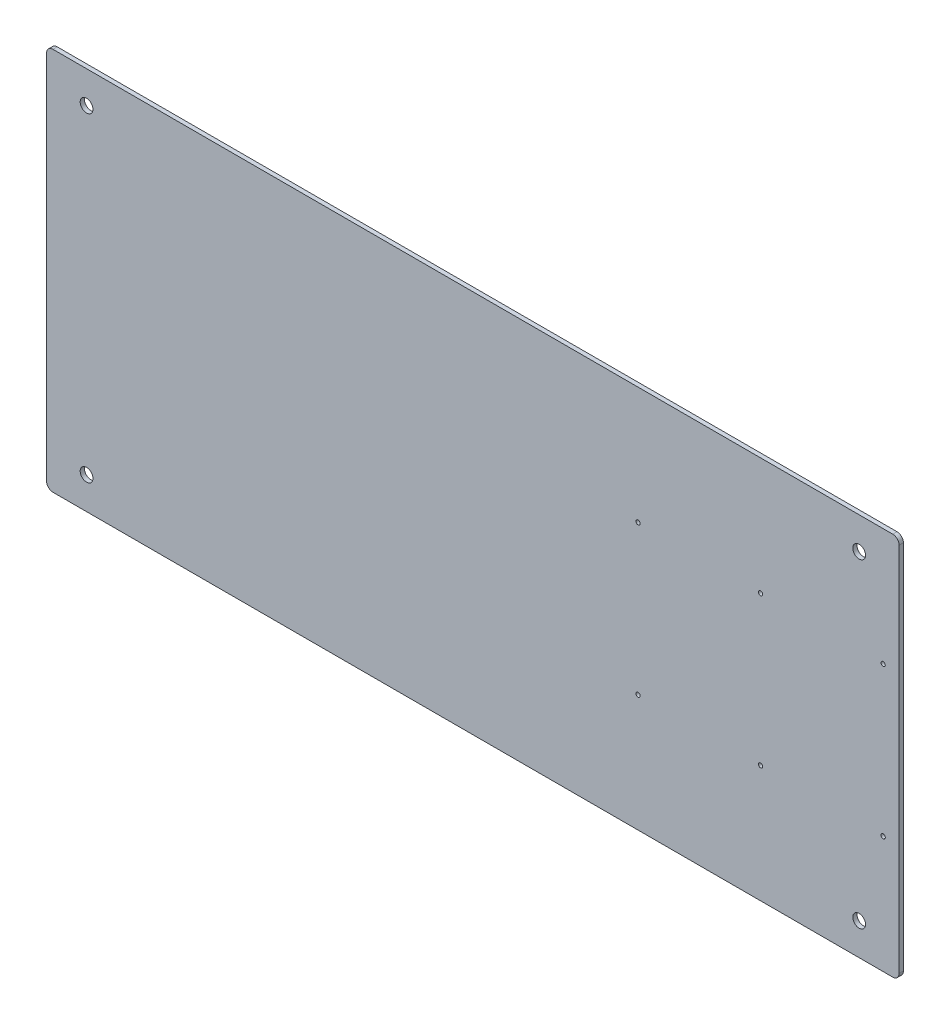
ISO-10303-21;
HEADER;
FILE_DESCRIPTION(('STEP AP214'),'2;1');
FILE_NAME('part.step','',(''),(''),'','','');
FILE_SCHEMA(('AUTOMOTIVE_DESIGN { 1 0 10303 214 1 1 1 1 }'));
ENDSEC;
DATA;
#1=APPLICATION_CONTEXT('core data for automotive mechanical design processes');
#2=APPLICATION_PROTOCOL_DEFINITION('international standard','automotive_design',2000,#1);
#3=PRODUCT_CONTEXT('',#1,'mechanical');
#4=PRODUCT('Part','Part','',(#3));
#5=PRODUCT_RELATED_PRODUCT_CATEGORY('part','',(#4));
#6=PRODUCT_DEFINITION_FORMATION('','',#4);
#7=PRODUCT_DEFINITION_CONTEXT('part definition',#1,'design');
#8=PRODUCT_DEFINITION('design','',#6,#7);
#9=PRODUCT_DEFINITION_SHAPE('','',#8);
#10=(LENGTH_UNIT() NAMED_UNIT(*) SI_UNIT(.MILLI.,.METRE.));
#11=(NAMED_UNIT(*) PLANE_ANGLE_UNIT() SI_UNIT($,.RADIAN.));
#12=(NAMED_UNIT(*) SI_UNIT($,.STERADIAN.) SOLID_ANGLE_UNIT());
#13=UNCERTAINTY_MEASURE_WITH_UNIT(LENGTH_MEASURE(1.E-05),#10,'distance_accuracy_value','');
#14=(GEOMETRIC_REPRESENTATION_CONTEXT(3) GLOBAL_UNCERTAINTY_ASSIGNED_CONTEXT((#13)) GLOBAL_UNIT_ASSIGNED_CONTEXT((#10,
#11,#12)) REPRESENTATION_CONTEXT('',''));
#15=CARTESIAN_POINT('',(0.,0.,0.));
#16=DIRECTION('',(0.,0.,1.));
#17=DIRECTION('',(1.,0.,0.));
#18=AXIS2_PLACEMENT_3D('',#15,#16,#17);
#19=CARTESIAN_POINT('',(0.,0.,4.));
#20=DIRECTION('',(0.,0.,-1.));
#21=DIRECTION('',(-1.,0.,0.));
#22=AXIS2_PLACEMENT_3D('',#19,#20,#21);
#23=PLANE('',#22);
#24=DIRECTION('',(0.,-1.,0.));
#25=VECTOR('',#24,1.);
#26=CARTESIAN_POINT('',(-400.,-180.,4.));
#27=LINE('',#26,#25);
#28=CARTESIAN_POINT('',(-400.,174.,4.));
#29=VERTEX_POINT('',#28);
#30=CARTESIAN_POINT('',(-400.,-174.,4.));
#31=VERTEX_POINT('',#30);
#32=EDGE_CURVE('E185',#29,#31,#27,.T.);
#33=ORIENTED_EDGE('',*,*,#32,.T.);
#34=CARTESIAN_POINT('',(-394.,-174.,4.));
#35=DIRECTION('',(0.,0.,-1.));
#36=DIRECTION('',(-1.,0.,0.));
#37=AXIS2_PLACEMENT_3D('',#34,#35,#36);
#38=CIRCLE('',#37,6.);
#39=CARTESIAN_POINT('',(-394.,-180.,4.));
#40=VERTEX_POINT('',#39);
#41=EDGE_CURVE('E173',#31,#40,#38,.F.);
#42=ORIENTED_EDGE('',*,*,#41,.T.);
#43=DIRECTION('',(1.,0.,0.));
#44=VECTOR('',#43,1.);
#45=CARTESIAN_POINT('',(-400.,-180.,4.));
#46=LINE('',#45,#44);
#47=CARTESIAN_POINT('',(394.,-180.,4.));
#48=VERTEX_POINT('',#47);
#49=EDGE_CURVE('E131',#40,#48,#46,.T.);
#50=ORIENTED_EDGE('',*,*,#49,.T.);
#51=CARTESIAN_POINT('',(394.,-174.,4.));
#52=DIRECTION('',(0.,0.,-1.));
#53=DIRECTION('',(-1.,0.,0.));
#54=AXIS2_PLACEMENT_3D('',#51,#52,#53);
#55=CIRCLE('',#54,6.);
#56=CARTESIAN_POINT('',(400.,-174.,4.));
#57=VERTEX_POINT('',#56);
#58=EDGE_CURVE('E170',#48,#57,#55,.F.);
#59=ORIENTED_EDGE('',*,*,#58,.T.);
#60=DIRECTION('',(0.,1.,0.));
#61=VECTOR('',#60,1.);
#62=CARTESIAN_POINT('',(400.,-180.,4.));
#63=LINE('',#62,#61);
#64=CARTESIAN_POINT('',(400.,174.,4.));
#65=VERTEX_POINT('',#64);
#66=EDGE_CURVE('E140',#57,#65,#63,.T.);
#67=ORIENTED_EDGE('',*,*,#66,.T.);
#68=CARTESIAN_POINT('',(394.,174.,4.));
#69=DIRECTION('',(0.,0.,-1.));
#70=DIRECTION('',(-1.,0.,0.));
#71=AXIS2_PLACEMENT_3D('',#68,#69,#70);
#72=CIRCLE('',#71,6.);
#73=CARTESIAN_POINT('',(394.,180.,4.));
#74=VERTEX_POINT('',#73);
#75=EDGE_CURVE('E65',#65,#74,#72,.F.);
#76=ORIENTED_EDGE('',*,*,#75,.T.);
#77=DIRECTION('',(-1.,0.,0.));
#78=VECTOR('',#77,1.);
#79=CARTESIAN_POINT('',(-400.,180.,4.));
#80=LINE('',#79,#78);
#81=CARTESIAN_POINT('',(-394.,180.,4.));
#82=VERTEX_POINT('',#81);
#83=EDGE_CURVE('E145',#74,#82,#80,.T.);
#84=ORIENTED_EDGE('',*,*,#83,.T.);
#85=CARTESIAN_POINT('',(-394.,174.,4.));
#86=DIRECTION('',(0.,0.,-1.));
#87=DIRECTION('',(-1.,0.,0.));
#88=AXIS2_PLACEMENT_3D('',#85,#86,#87);
#89=CIRCLE('',#88,6.);
#90=EDGE_CURVE('E165',#82,#29,#89,.F.);
#91=ORIENTED_EDGE('',*,*,#90,.T.);
#92=EDGE_LOOP('',(#33,#42,#50,#59,#67,#76,#84,#91));
#93=FACE_BOUND('',#92,.T.);
#94=CARTESIAN_POINT('',(-362.5,-150.,4.));
#95=DIRECTION('',(0.,0.,1.));
#96=DIRECTION('',(1.,0.,0.));
#97=AXIS2_PLACEMENT_3D('',#94,#95,#96);
#98=CIRCLE('',#97,5.99999999999999);
#99=CARTESIAN_POINT('',(-356.5,-150.,4.));
#100=VERTEX_POINT('',#99);
#101=EDGE_CURVE('E197',#100,#100,#98,.T.);
#102=ORIENTED_EDGE('',*,*,#101,.F.);
#103=EDGE_LOOP('',(#102));
#104=FACE_BOUND('',#103,.T.);
#105=CARTESIAN_POINT('',(-362.5,150.,4.));
#106=DIRECTION('',(0.,0.,1.));
#107=DIRECTION('',(1.,0.,0.));
#108=AXIS2_PLACEMENT_3D('',#105,#106,#107);
#109=CIRCLE('',#108,5.99999999999999);
#110=CARTESIAN_POINT('',(-356.5,150.,4.));
#111=VERTEX_POINT('',#110);
#112=EDGE_CURVE('E339',#111,#111,#109,.T.);
#113=ORIENTED_EDGE('',*,*,#112,.F.);
#114=EDGE_LOOP('',(#113));
#115=FACE_BOUND('',#114,.T.);
#116=CARTESIAN_POINT('',(362.5,-150.,4.));
#117=DIRECTION('',(0.,0.,1.));
#118=DIRECTION('',(1.,0.,0.));
#119=AXIS2_PLACEMENT_3D('',#116,#117,#118);
#120=CIRCLE('',#119,5.99999999999999);
#121=CARTESIAN_POINT('',(368.5,-150.,4.));
#122=VERTEX_POINT('',#121);
#123=EDGE_CURVE('E331',#122,#122,#120,.T.);
#124=ORIENTED_EDGE('',*,*,#123,.F.);
#125=EDGE_LOOP('',(#124));
#126=FACE_BOUND('',#125,.T.);
#127=CARTESIAN_POINT('',(362.5,150.,4.));
#128=DIRECTION('',(0.,0.,1.));
#129=DIRECTION('',(1.,0.,0.));
#130=AXIS2_PLACEMENT_3D('',#127,#128,#129);
#131=CIRCLE('',#130,5.99999999999999);
#132=CARTESIAN_POINT('',(368.5,150.,4.));
#133=VERTEX_POINT('',#132);
#134=EDGE_CURVE('E323',#133,#133,#131,.T.);
#135=ORIENTED_EDGE('',*,*,#134,.F.);
#136=EDGE_LOOP('',(#135));
#137=FACE_BOUND('',#136,.T.);
#138=CARTESIAN_POINT('',(155.,70.,4.));
#139=DIRECTION('',(0.,0.,1.));
#140=DIRECTION('',(1.,0.,0.));
#141=AXIS2_PLACEMENT_3D('',#138,#139,#140);
#142=CIRCLE('',#141,2.);
#143=CARTESIAN_POINT('',(157.,70.,4.));
#144=VERTEX_POINT('',#143);
#145=EDGE_CURVE('E315',#144,#144,#142,.T.);
#146=ORIENTED_EDGE('',*,*,#145,.F.);
#147=EDGE_LOOP('',(#146));
#148=FACE_BOUND('',#147,.T.);
#149=CARTESIAN_POINT('',(270.,70.,4.));
#150=DIRECTION('',(0.,0.,1.));
#151=DIRECTION('',(1.,0.,0.));
#152=AXIS2_PLACEMENT_3D('',#149,#150,#151);
#153=CIRCLE('',#152,2.);
#154=CARTESIAN_POINT('',(272.,70.,4.));
#155=VERTEX_POINT('',#154);
#156=EDGE_CURVE('E307',#155,#155,#153,.T.);
#157=ORIENTED_EDGE('',*,*,#156,.F.);
#158=EDGE_LOOP('',(#157));
#159=FACE_BOUND('',#158,.T.);
#160=CARTESIAN_POINT('',(385.,70.,4.));
#161=DIRECTION('',(0.,0.,1.));
#162=DIRECTION('',(1.,0.,0.));
#163=AXIS2_PLACEMENT_3D('',#160,#161,#162);
#164=CIRCLE('',#163,2.);
#165=CARTESIAN_POINT('',(387.,70.,4.));
#166=VERTEX_POINT('',#165);
#167=EDGE_CURVE('E299',#166,#166,#164,.T.);
#168=ORIENTED_EDGE('',*,*,#167,.F.);
#169=EDGE_LOOP('',(#168));
#170=FACE_BOUND('',#169,.T.);
#171=CARTESIAN_POINT('',(385.,-70.,4.));
#172=DIRECTION('',(0.,0.,1.));
#173=DIRECTION('',(1.,0.,0.));
#174=AXIS2_PLACEMENT_3D('',#171,#172,#173);
#175=CIRCLE('',#174,2.);
#176=CARTESIAN_POINT('',(387.,-70.,4.));
#177=VERTEX_POINT('',#176);
#178=EDGE_CURVE('E291',#177,#177,#175,.T.);
#179=ORIENTED_EDGE('',*,*,#178,.F.);
#180=EDGE_LOOP('',(#179));
#181=FACE_BOUND('',#180,.T.);
#182=CARTESIAN_POINT('',(270.,-70.,4.));
#183=DIRECTION('',(0.,0.,1.));
#184=DIRECTION('',(1.,0.,0.));
#185=AXIS2_PLACEMENT_3D('',#182,#183,#184);
#186=CIRCLE('',#185,2.);
#187=CARTESIAN_POINT('',(272.,-70.,4.));
#188=VERTEX_POINT('',#187);
#189=EDGE_CURVE('E283',#188,#188,#186,.T.);
#190=ORIENTED_EDGE('',*,*,#189,.F.);
#191=EDGE_LOOP('',(#190));
#192=FACE_BOUND('',#191,.T.);
#193=CARTESIAN_POINT('',(155.,-70.,4.));
#194=DIRECTION('',(0.,0.,1.));
#195=DIRECTION('',(1.,0.,0.));
#196=AXIS2_PLACEMENT_3D('',#193,#194,#195);
#197=CIRCLE('',#196,2.);
#198=CARTESIAN_POINT('',(157.,-70.,4.));
#199=VERTEX_POINT('',#198);
#200=EDGE_CURVE('E272',#199,#199,#197,.T.);
#201=ORIENTED_EDGE('',*,*,#200,.F.);
#202=EDGE_LOOP('',(#201));
#203=FACE_BOUND('',#202,.T.);
#204=ADVANCED_FACE('F43',(#93,#104,#115,#126,#137,#148,#159,#170,#181,#192,#203),#23,.F.);
#205=CARTESIAN_POINT('',(0.,0.,0.));
#206=DIRECTION('',(0.,0.,-1.));
#207=DIRECTION('',(-1.,0.,0.));
#208=AXIS2_PLACEMENT_3D('',#205,#206,#207);
#209=PLANE('',#208);
#210=CARTESIAN_POINT('',(270.,-70.,0.));
#211=DIRECTION('',(0.,0.,1.));
#212=DIRECTION('',(1.,0.,0.));
#213=AXIS2_PLACEMENT_3D('',#210,#211,#212);
#214=CIRCLE('',#213,2.);
#215=CARTESIAN_POINT('',(272.,-70.,0.));
#216=VERTEX_POINT('',#215);
#217=EDGE_CURVE('E280',#216,#216,#214,.T.);
#218=ORIENTED_EDGE('',*,*,#217,.T.);
#219=EDGE_LOOP('',(#218));
#220=FACE_BOUND('',#219,.T.);
#221=CARTESIAN_POINT('',(385.,70.,0.));
#222=DIRECTION('',(0.,0.,1.));
#223=DIRECTION('',(1.,0.,0.));
#224=AXIS2_PLACEMENT_3D('',#221,#222,#223);
#225=CIRCLE('',#224,2.);
#226=CARTESIAN_POINT('',(387.,70.,0.));
#227=VERTEX_POINT('',#226);
#228=EDGE_CURVE('E295',#227,#227,#225,.T.);
#229=ORIENTED_EDGE('',*,*,#228,.T.);
#230=EDGE_LOOP('',(#229));
#231=FACE_BOUND('',#230,.T.);
#232=CARTESIAN_POINT('',(155.,70.,0.));
#233=DIRECTION('',(0.,0.,1.));
#234=DIRECTION('',(1.,0.,0.));
#235=AXIS2_PLACEMENT_3D('',#232,#233,#234);
#236=CIRCLE('',#235,2.);
#237=CARTESIAN_POINT('',(157.,70.,0.));
#238=VERTEX_POINT('',#237);
#239=EDGE_CURVE('E311',#238,#238,#236,.T.);
#240=ORIENTED_EDGE('',*,*,#239,.T.);
#241=EDGE_LOOP('',(#240));
#242=FACE_BOUND('',#241,.T.);
#243=CARTESIAN_POINT('',(362.5,-150.,0.));
#244=DIRECTION('',(0.,0.,1.));
#245=DIRECTION('',(1.,0.,0.));
#246=AXIS2_PLACEMENT_3D('',#243,#244,#245);
#247=CIRCLE('',#246,5.99999999999999);
#248=CARTESIAN_POINT('',(368.5,-150.,0.));
#249=VERTEX_POINT('',#248);
#250=EDGE_CURVE('E327',#249,#249,#247,.T.);
#251=ORIENTED_EDGE('',*,*,#250,.T.);
#252=EDGE_LOOP('',(#251));
#253=FACE_BOUND('',#252,.T.);
#254=CARTESIAN_POINT('',(-362.5,-150.,0.));
#255=DIRECTION('',(0.,0.,1.));
#256=DIRECTION('',(1.,0.,0.));
#257=AXIS2_PLACEMENT_3D('',#254,#255,#256);
#258=CIRCLE('',#257,5.99999999999999);
#259=CARTESIAN_POINT('',(-356.5,-150.,0.));
#260=VERTEX_POINT('',#259);
#261=EDGE_CURVE('E343',#260,#260,#258,.T.);
#262=ORIENTED_EDGE('',*,*,#261,.T.);
#263=EDGE_LOOP('',(#262));
#264=FACE_BOUND('',#263,.T.);
#265=DIRECTION('',(1.,0.,0.));
#266=VECTOR('',#265,1.);
#267=CARTESIAN_POINT('',(-400.,-180.,0.));
#268=LINE('',#267,#266);
#269=CARTESIAN_POINT('',(-394.,-180.,0.));
#270=VERTEX_POINT('',#269);
#271=CARTESIAN_POINT('',(394.,-180.,0.));
#272=VERTEX_POINT('',#271);
#273=EDGE_CURVE('E128',#270,#272,#268,.T.);
#274=ORIENTED_EDGE('',*,*,#273,.F.);
#275=CARTESIAN_POINT('',(-394.,-174.,0.));
#276=DIRECTION('',(0.,0.,-1.));
#277=DIRECTION('',(-1.,0.,0.));
#278=AXIS2_PLACEMENT_3D('',#275,#276,#277);
#279=CIRCLE('',#278,6.);
#280=CARTESIAN_POINT('',(-400.,-174.,0.));
#281=VERTEX_POINT('',#280);
#282=EDGE_CURVE('E110',#270,#281,#279,.T.);
#283=ORIENTED_EDGE('',*,*,#282,.T.);
#284=DIRECTION('',(0.,-1.,0.));
#285=VECTOR('',#284,1.);
#286=CARTESIAN_POINT('',(-400.,-180.,0.));
#287=LINE('',#286,#285);
#288=CARTESIAN_POINT('',(-400.,174.,0.));
#289=VERTEX_POINT('',#288);
#290=EDGE_CURVE('E141',#289,#281,#287,.T.);
#291=ORIENTED_EDGE('',*,*,#290,.F.);
#292=CARTESIAN_POINT('',(-394.,174.,0.));
#293=DIRECTION('',(0.,0.,-1.));
#294=DIRECTION('',(-1.,0.,0.));
#295=AXIS2_PLACEMENT_3D('',#292,#293,#294);
#296=CIRCLE('',#295,6.);
#297=CARTESIAN_POINT('',(-394.,180.,0.));
#298=VERTEX_POINT('',#297);
#299=EDGE_CURVE('E133',#289,#298,#296,.T.);
#300=ORIENTED_EDGE('',*,*,#299,.T.);
#301=DIRECTION('',(-1.,0.,0.));
#302=VECTOR('',#301,1.);
#303=CARTESIAN_POINT('',(-400.,180.,0.));
#304=LINE('',#303,#302);
#305=CARTESIAN_POINT('',(394.,180.,0.));
#306=VERTEX_POINT('',#305);
#307=EDGE_CURVE('E147',#306,#298,#304,.T.);
#308=ORIENTED_EDGE('',*,*,#307,.F.);
#309=CARTESIAN_POINT('',(394.,174.,0.));
#310=DIRECTION('',(0.,0.,-1.));
#311=DIRECTION('',(-1.,0.,0.));
#312=AXIS2_PLACEMENT_3D('',#309,#310,#311);
#313=CIRCLE('',#312,6.);
#314=CARTESIAN_POINT('',(400.,174.,0.));
#315=VERTEX_POINT('',#314);
#316=EDGE_CURVE('E155',#306,#315,#313,.T.);
#317=ORIENTED_EDGE('',*,*,#316,.T.);
#318=DIRECTION('',(0.,1.,0.));
#319=VECTOR('',#318,1.);
#320=CARTESIAN_POINT('',(400.,-180.,0.));
#321=LINE('',#320,#319);
#322=CARTESIAN_POINT('',(400.,-174.,0.));
#323=VERTEX_POINT('',#322);
#324=EDGE_CURVE('E194',#323,#315,#321,.T.);
#325=ORIENTED_EDGE('',*,*,#324,.F.);
#326=CARTESIAN_POINT('',(394.,-174.,0.));
#327=DIRECTION('',(0.,0.,-1.));
#328=DIRECTION('',(-1.,0.,0.));
#329=AXIS2_PLACEMENT_3D('',#326,#327,#328);
#330=CIRCLE('',#329,6.);
#331=EDGE_CURVE('E122',#323,#272,#330,.T.);
#332=ORIENTED_EDGE('',*,*,#331,.T.);
#333=EDGE_LOOP('',(#274,#283,#291,#300,#308,#317,#325,#332));
#334=FACE_BOUND('',#333,.T.);
#335=CARTESIAN_POINT('',(-362.5,150.,0.));
#336=DIRECTION('',(0.,0.,1.));
#337=DIRECTION('',(1.,0.,0.));
#338=AXIS2_PLACEMENT_3D('',#335,#336,#337);
#339=CIRCLE('',#338,5.99999999999999);
#340=CARTESIAN_POINT('',(-356.5,150.,0.));
#341=VERTEX_POINT('',#340);
#342=EDGE_CURVE('E335',#341,#341,#339,.T.);
#343=ORIENTED_EDGE('',*,*,#342,.T.);
#344=EDGE_LOOP('',(#343));
#345=FACE_BOUND('',#344,.T.);
#346=CARTESIAN_POINT('',(362.5,150.,0.));
#347=DIRECTION('',(0.,0.,1.));
#348=DIRECTION('',(1.,0.,0.));
#349=AXIS2_PLACEMENT_3D('',#346,#347,#348);
#350=CIRCLE('',#349,5.99999999999999);
#351=CARTESIAN_POINT('',(368.5,150.,0.));
#352=VERTEX_POINT('',#351);
#353=EDGE_CURVE('E319',#352,#352,#350,.T.);
#354=ORIENTED_EDGE('',*,*,#353,.T.);
#355=EDGE_LOOP('',(#354));
#356=FACE_BOUND('',#355,.T.);
#357=CARTESIAN_POINT('',(270.,70.,0.));
#358=DIRECTION('',(0.,0.,1.));
#359=DIRECTION('',(1.,0.,0.));
#360=AXIS2_PLACEMENT_3D('',#357,#358,#359);
#361=CIRCLE('',#360,2.);
#362=CARTESIAN_POINT('',(272.,70.,0.));
#363=VERTEX_POINT('',#362);
#364=EDGE_CURVE('E303',#363,#363,#361,.T.);
#365=ORIENTED_EDGE('',*,*,#364,.T.);
#366=EDGE_LOOP('',(#365));
#367=FACE_BOUND('',#366,.T.);
#368=CARTESIAN_POINT('',(385.,-70.,0.));
#369=DIRECTION('',(0.,0.,1.));
#370=DIRECTION('',(1.,0.,0.));
#371=AXIS2_PLACEMENT_3D('',#368,#369,#370);
#372=CIRCLE('',#371,2.);
#373=CARTESIAN_POINT('',(387.,-70.,0.));
#374=VERTEX_POINT('',#373);
#375=EDGE_CURVE('E287',#374,#374,#372,.T.);
#376=ORIENTED_EDGE('',*,*,#375,.T.);
#377=EDGE_LOOP('',(#376));
#378=FACE_BOUND('',#377,.T.);
#379=CARTESIAN_POINT('',(155.,-70.,0.));
#380=DIRECTION('',(0.,0.,1.));
#381=DIRECTION('',(1.,0.,0.));
#382=AXIS2_PLACEMENT_3D('',#379,#380,#381);
#383=CIRCLE('',#382,2.);
#384=CARTESIAN_POINT('',(157.,-70.,0.));
#385=VERTEX_POINT('',#384);
#386=EDGE_CURVE('E275',#385,#385,#383,.T.);
#387=ORIENTED_EDGE('',*,*,#386,.T.);
#388=EDGE_LOOP('',(#387));
#389=FACE_BOUND('',#388,.T.);
#390=ADVANCED_FACE('F136',(#220,#231,#242,#253,#264,#334,#345,#356,#367,#378,#389),#209,.T.);
#391=CARTESIAN_POINT('',(400.,-180.,4.));
#392=DIRECTION('',(-1.,0.,0.));
#393=DIRECTION('',(0.,0.,1.));
#394=AXIS2_PLACEMENT_3D('',#391,#392,#393);
#395=PLANE('',#394);
#396=ORIENTED_EDGE('',*,*,#66,.F.);
#397=DIRECTION('',(0.,0.,-1.));
#398=VECTOR('',#397,1.);
#399=CARTESIAN_POINT('',(400.,-174.,4.));
#400=LINE('',#399,#398);
#401=EDGE_CURVE('E179',#57,#323,#400,.T.);
#402=ORIENTED_EDGE('',*,*,#401,.T.);
#403=ORIENTED_EDGE('',*,*,#324,.T.);
#404=DIRECTION('',(0.,0.,-1.));
#405=VECTOR('',#404,1.);
#406=CARTESIAN_POINT('',(400.,174.,4.));
#407=LINE('',#406,#405);
#408=EDGE_CURVE('E176',#315,#65,#407,.F.);
#409=ORIENTED_EDGE('',*,*,#408,.T.);
#410=EDGE_LOOP('',(#396,#402,#403,#409));
#411=FACE_BOUND('',#410,.T.);
#412=ADVANCED_FACE('F216',(#411),#395,.F.);
#413=CARTESIAN_POINT('',(-400.,180.,4.));
#414=DIRECTION('',(0.,-1.,0.));
#415=DIRECTION('',(0.,0.,-1.));
#416=AXIS2_PLACEMENT_3D('',#413,#414,#415);
#417=PLANE('',#416);
#418=ORIENTED_EDGE('',*,*,#83,.F.);
#419=DIRECTION('',(0.,0.,-1.));
#420=VECTOR('',#419,1.);
#421=CARTESIAN_POINT('',(394.,180.,4.));
#422=LINE('',#421,#420);
#423=EDGE_CURVE('E11',#74,#306,#422,.T.);
#424=ORIENTED_EDGE('',*,*,#423,.T.);
#425=ORIENTED_EDGE('',*,*,#307,.T.);
#426=DIRECTION('',(0.,0.,-1.));
#427=VECTOR('',#426,1.);
#428=CARTESIAN_POINT('',(-394.,180.,4.));
#429=LINE('',#428,#427);
#430=EDGE_CURVE('E52',#298,#82,#429,.F.);
#431=ORIENTED_EDGE('',*,*,#430,.T.);
#432=EDGE_LOOP('',(#418,#424,#425,#431));
#433=FACE_BOUND('',#432,.T.);
#434=ADVANCED_FACE('F200',(#433),#417,.F.);
#435=CARTESIAN_POINT('',(-400.,-180.,4.));
#436=DIRECTION('',(1.,0.,0.));
#437=DIRECTION('',(0.,0.,-1.));
#438=AXIS2_PLACEMENT_3D('',#435,#436,#437);
#439=PLANE('',#438);
#440=ORIENTED_EDGE('',*,*,#290,.T.);
#441=DIRECTION('',(0.,0.,-1.));
#442=VECTOR('',#441,1.);
#443=CARTESIAN_POINT('',(-400.,-174.,4.));
#444=LINE('',#443,#442);
#445=EDGE_CURVE('E115',#281,#31,#444,.F.);
#446=ORIENTED_EDGE('',*,*,#445,.T.);
#447=ORIENTED_EDGE('',*,*,#32,.F.);
#448=DIRECTION('',(0.,0.,-1.));
#449=VECTOR('',#448,1.);
#450=CARTESIAN_POINT('',(-400.,174.,4.));
#451=LINE('',#450,#449);
#452=EDGE_CURVE('E121',#29,#289,#451,.T.);
#453=ORIENTED_EDGE('',*,*,#452,.T.);
#454=EDGE_LOOP('',(#440,#446,#447,#453));
#455=FACE_BOUND('',#454,.T.);
#456=ADVANCED_FACE('F207',(#455),#439,.F.);
#457=CARTESIAN_POINT('',(-400.,-180.,4.));
#458=DIRECTION('',(0.,1.,0.));
#459=DIRECTION('',(0.,0.,1.));
#460=AXIS2_PLACEMENT_3D('',#457,#458,#459);
#461=PLANE('',#460);
#462=ORIENTED_EDGE('',*,*,#49,.F.);
#463=DIRECTION('',(0.,0.,-1.));
#464=VECTOR('',#463,1.);
#465=CARTESIAN_POINT('',(-394.,-180.,4.));
#466=LINE('',#465,#464);
#467=EDGE_CURVE('E114',#40,#270,#466,.T.);
#468=ORIENTED_EDGE('',*,*,#467,.T.);
#469=ORIENTED_EDGE('',*,*,#273,.T.);
#470=DIRECTION('',(0.,0.,-1.));
#471=VECTOR('',#470,1.);
#472=CARTESIAN_POINT('',(394.,-180.,4.));
#473=LINE('',#472,#471);
#474=EDGE_CURVE('E134',#272,#48,#473,.F.);
#475=ORIENTED_EDGE('',*,*,#474,.T.);
#476=EDGE_LOOP('',(#462,#468,#469,#475));
#477=FACE_BOUND('',#476,.T.);
#478=ADVANCED_FACE('F127',(#477),#461,.F.);
#479=CARTESIAN_POINT('',(-362.5,-150.,4.));
#480=DIRECTION('',(0.,0.,-1.));
#481=DIRECTION('',(-1.,0.,0.));
#482=AXIS2_PLACEMENT_3D('',#479,#480,#481);
#483=CYLINDRICAL_SURFACE('',#482,5.99999999999999);
#484=ORIENTED_EDGE('',*,*,#101,.T.);
#485=EDGE_LOOP('',(#484));
#486=FACE_BOUND('',#485,.T.);
#487=ORIENTED_EDGE('',*,*,#261,.F.);
#488=EDGE_LOOP('',(#487));
#489=FACE_BOUND('',#488,.T.);
#490=ADVANCED_FACE('F214',(#486,#489),#483,.F.);
#491=CARTESIAN_POINT('',(-362.5,150.,4.));
#492=DIRECTION('',(0.,0.,-1.));
#493=DIRECTION('',(-1.,0.,0.));
#494=AXIS2_PLACEMENT_3D('',#491,#492,#493);
#495=CYLINDRICAL_SURFACE('',#494,5.99999999999999);
#496=ORIENTED_EDGE('',*,*,#112,.T.);
#497=EDGE_LOOP('',(#496));
#498=FACE_BOUND('',#497,.T.);
#499=ORIENTED_EDGE('',*,*,#342,.F.);
#500=EDGE_LOOP('',(#499));
#501=FACE_BOUND('',#500,.T.);
#502=ADVANCED_FACE('F228',(#498,#501),#495,.F.);
#503=CARTESIAN_POINT('',(362.5,-150.,4.));
#504=DIRECTION('',(0.,0.,-1.));
#505=DIRECTION('',(-1.,0.,0.));
#506=AXIS2_PLACEMENT_3D('',#503,#504,#505);
#507=CYLINDRICAL_SURFACE('',#506,5.99999999999999);
#508=ORIENTED_EDGE('',*,*,#123,.T.);
#509=EDGE_LOOP('',(#508));
#510=FACE_BOUND('',#509,.T.);
#511=ORIENTED_EDGE('',*,*,#250,.F.);
#512=EDGE_LOOP('',(#511));
#513=FACE_BOUND('',#512,.T.);
#514=ADVANCED_FACE('F232',(#510,#513),#507,.F.);
#515=CARTESIAN_POINT('',(362.5,150.,4.));
#516=DIRECTION('',(0.,0.,-1.));
#517=DIRECTION('',(-1.,0.,0.));
#518=AXIS2_PLACEMENT_3D('',#515,#516,#517);
#519=CYLINDRICAL_SURFACE('',#518,5.99999999999999);
#520=ORIENTED_EDGE('',*,*,#134,.T.);
#521=EDGE_LOOP('',(#520));
#522=FACE_BOUND('',#521,.T.);
#523=ORIENTED_EDGE('',*,*,#353,.F.);
#524=EDGE_LOOP('',(#523));
#525=FACE_BOUND('',#524,.T.);
#526=ADVANCED_FACE('F236',(#522,#525),#519,.F.);
#527=CARTESIAN_POINT('',(155.,70.,4.));
#528=DIRECTION('',(0.,0.,-1.));
#529=DIRECTION('',(-1.,0.,0.));
#530=AXIS2_PLACEMENT_3D('',#527,#528,#529);
#531=CYLINDRICAL_SURFACE('',#530,2.);
#532=ORIENTED_EDGE('',*,*,#145,.T.);
#533=EDGE_LOOP('',(#532));
#534=FACE_BOUND('',#533,.T.);
#535=ORIENTED_EDGE('',*,*,#239,.F.);
#536=EDGE_LOOP('',(#535));
#537=FACE_BOUND('',#536,.T.);
#538=ADVANCED_FACE('F240',(#534,#537),#531,.F.);
#539=CARTESIAN_POINT('',(270.,70.,4.));
#540=DIRECTION('',(0.,0.,-1.));
#541=DIRECTION('',(-1.,0.,0.));
#542=AXIS2_PLACEMENT_3D('',#539,#540,#541);
#543=CYLINDRICAL_SURFACE('',#542,2.);
#544=ORIENTED_EDGE('',*,*,#156,.T.);
#545=EDGE_LOOP('',(#544));
#546=FACE_BOUND('',#545,.T.);
#547=ORIENTED_EDGE('',*,*,#364,.F.);
#548=EDGE_LOOP('',(#547));
#549=FACE_BOUND('',#548,.T.);
#550=ADVANCED_FACE('F244',(#546,#549),#543,.F.);
#551=CARTESIAN_POINT('',(385.,70.,4.));
#552=DIRECTION('',(0.,0.,-1.));
#553=DIRECTION('',(-1.,0.,0.));
#554=AXIS2_PLACEMENT_3D('',#551,#552,#553);
#555=CYLINDRICAL_SURFACE('',#554,2.);
#556=ORIENTED_EDGE('',*,*,#167,.T.);
#557=EDGE_LOOP('',(#556));
#558=FACE_BOUND('',#557,.T.);
#559=ORIENTED_EDGE('',*,*,#228,.F.);
#560=EDGE_LOOP('',(#559));
#561=FACE_BOUND('',#560,.T.);
#562=ADVANCED_FACE('F248',(#558,#561),#555,.F.);
#563=CARTESIAN_POINT('',(385.,-70.,4.));
#564=DIRECTION('',(0.,0.,-1.));
#565=DIRECTION('',(-1.,0.,0.));
#566=AXIS2_PLACEMENT_3D('',#563,#564,#565);
#567=CYLINDRICAL_SURFACE('',#566,2.);
#568=ORIENTED_EDGE('',*,*,#178,.T.);
#569=EDGE_LOOP('',(#568));
#570=FACE_BOUND('',#569,.T.);
#571=ORIENTED_EDGE('',*,*,#375,.F.);
#572=EDGE_LOOP('',(#571));
#573=FACE_BOUND('',#572,.T.);
#574=ADVANCED_FACE('F252',(#570,#573),#567,.F.);
#575=CARTESIAN_POINT('',(270.,-70.,4.));
#576=DIRECTION('',(0.,0.,-1.));
#577=DIRECTION('',(-1.,0.,0.));
#578=AXIS2_PLACEMENT_3D('',#575,#576,#577);
#579=CYLINDRICAL_SURFACE('',#578,2.);
#580=ORIENTED_EDGE('',*,*,#189,.T.);
#581=EDGE_LOOP('',(#580));
#582=FACE_BOUND('',#581,.T.);
#583=ORIENTED_EDGE('',*,*,#217,.F.);
#584=EDGE_LOOP('',(#583));
#585=FACE_BOUND('',#584,.T.);
#586=ADVANCED_FACE('F256',(#582,#585),#579,.F.);
#587=CARTESIAN_POINT('',(155.,-70.,4.));
#588=DIRECTION('',(0.,0.,-1.));
#589=DIRECTION('',(-1.,0.,0.));
#590=AXIS2_PLACEMENT_3D('',#587,#588,#589);
#591=CYLINDRICAL_SURFACE('',#590,2.);
#592=ORIENTED_EDGE('',*,*,#200,.T.);
#593=EDGE_LOOP('',(#592));
#594=FACE_BOUND('',#593,.T.);
#595=ORIENTED_EDGE('',*,*,#386,.F.);
#596=EDGE_LOOP('',(#595));
#597=FACE_BOUND('',#596,.T.);
#598=ADVANCED_FACE('F260',(#594,#597),#591,.F.);
#599=CARTESIAN_POINT('',(-394.,-174.,4.));
#600=DIRECTION('',(0.,0.,-1.));
#601=DIRECTION('',(-1.,0.,0.));
#602=AXIS2_PLACEMENT_3D('',#599,#600,#601);
#603=CYLINDRICAL_SURFACE('',#602,6.);
#604=ORIENTED_EDGE('',*,*,#41,.F.);
#605=ORIENTED_EDGE('',*,*,#445,.F.);
#606=ORIENTED_EDGE('',*,*,#282,.F.);
#607=ORIENTED_EDGE('',*,*,#467,.F.);
#608=EDGE_LOOP('',(#604,#605,#606,#607));
#609=FACE_BOUND('',#608,.T.);
#610=ADVANCED_FACE('F113',(#609),#603,.T.);
#611=CARTESIAN_POINT('',(394.,-174.,4.));
#612=DIRECTION('',(0.,0.,-1.));
#613=DIRECTION('',(-1.,0.,0.));
#614=AXIS2_PLACEMENT_3D('',#611,#612,#613);
#615=CYLINDRICAL_SURFACE('',#614,6.);
#616=ORIENTED_EDGE('',*,*,#58,.F.);
#617=ORIENTED_EDGE('',*,*,#474,.F.);
#618=ORIENTED_EDGE('',*,*,#331,.F.);
#619=ORIENTED_EDGE('',*,*,#401,.F.);
#620=EDGE_LOOP('',(#616,#617,#618,#619));
#621=FACE_BOUND('',#620,.T.);
#622=ADVANCED_FACE('F267',(#621),#615,.T.);
#623=CARTESIAN_POINT('',(394.,174.,4.));
#624=DIRECTION('',(0.,0.,-1.));
#625=DIRECTION('',(-1.,0.,0.));
#626=AXIS2_PLACEMENT_3D('',#623,#624,#625);
#627=CYLINDRICAL_SURFACE('',#626,6.);
#628=ORIENTED_EDGE('',*,*,#75,.F.);
#629=ORIENTED_EDGE('',*,*,#408,.F.);
#630=ORIENTED_EDGE('',*,*,#316,.F.);
#631=ORIENTED_EDGE('',*,*,#423,.F.);
#632=EDGE_LOOP('',(#628,#629,#630,#631));
#633=FACE_BOUND('',#632,.T.);
#634=ADVANCED_FACE('F397',(#633),#627,.T.);
#635=CARTESIAN_POINT('',(-394.,174.,4.));
#636=DIRECTION('',(0.,0.,-1.));
#637=DIRECTION('',(-1.,0.,0.));
#638=AXIS2_PLACEMENT_3D('',#635,#636,#637);
#639=CYLINDRICAL_SURFACE('',#638,6.);
#640=ORIENTED_EDGE('',*,*,#90,.F.);
#641=ORIENTED_EDGE('',*,*,#430,.F.);
#642=ORIENTED_EDGE('',*,*,#299,.F.);
#643=ORIENTED_EDGE('',*,*,#452,.F.);
#644=EDGE_LOOP('',(#640,#641,#642,#643));
#645=FACE_BOUND('',#644,.T.);
#646=ADVANCED_FACE('F45',(#645),#639,.T.);
#647=CLOSED_SHELL('',(#204,#390,#412,#434,#456,#478,#490,#502,#514,#526,#538,#550,#562,#574,
#586,#598,#610,#622,#634,#646));
#648=MANIFOLD_SOLID_BREP('B2',#647);
#649=ADVANCED_BREP_SHAPE_REPRESENTATION('',(#18,#648),#14);
#650=SHAPE_DEFINITION_REPRESENTATION(#9,#649);
ENDSEC;
END-ISO-10303-21;
